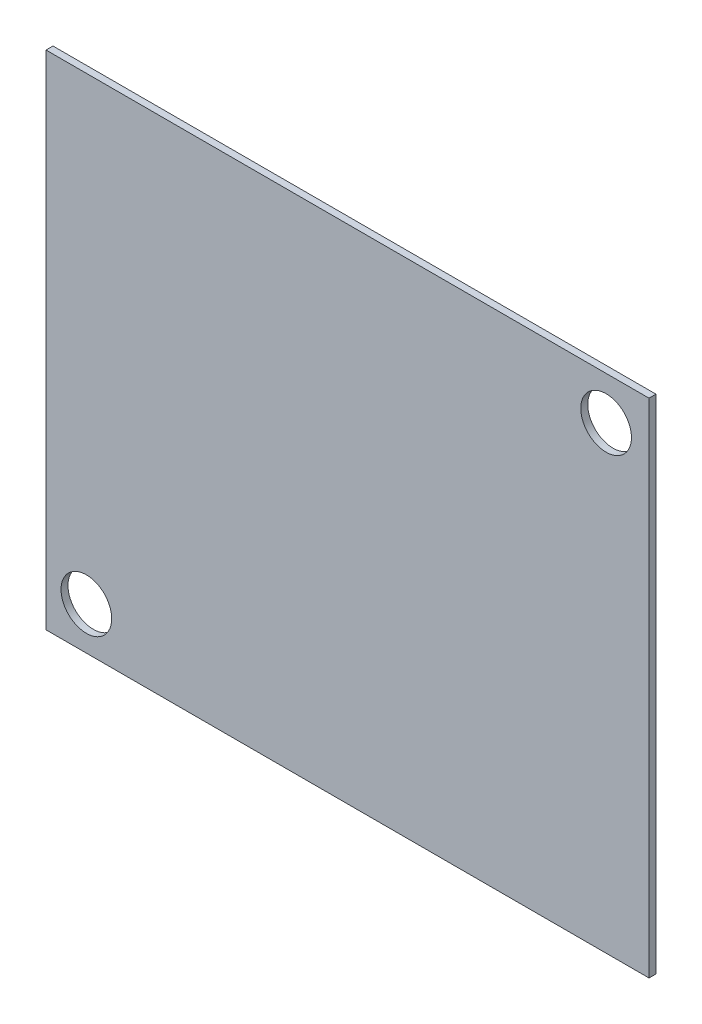
ISO-10303-21;
HEADER;
FILE_DESCRIPTION(('STEP AP214'),'2;1');
FILE_NAME('part.step','',(''),(''),'','','');
FILE_SCHEMA(('AUTOMOTIVE_DESIGN { 1 0 10303 214 1 1 1 1 }'));
ENDSEC;
DATA;
#1=APPLICATION_CONTEXT('core data for automotive mechanical design processes');
#2=APPLICATION_PROTOCOL_DEFINITION('international standard','automotive_design',2000,#1);
#3=PRODUCT_CONTEXT('',#1,'mechanical');
#4=PRODUCT('Part','Part','',(#3));
#5=PRODUCT_RELATED_PRODUCT_CATEGORY('part','',(#4));
#6=PRODUCT_DEFINITION_FORMATION('','',#4);
#7=PRODUCT_DEFINITION_CONTEXT('part definition',#1,'design');
#8=PRODUCT_DEFINITION('design','',#6,#7);
#9=PRODUCT_DEFINITION_SHAPE('','',#8);
#10=(LENGTH_UNIT() NAMED_UNIT(*) SI_UNIT(.MILLI.,.METRE.));
#11=(NAMED_UNIT(*) PLANE_ANGLE_UNIT() SI_UNIT($,.RADIAN.));
#12=(NAMED_UNIT(*) SI_UNIT($,.STERADIAN.) SOLID_ANGLE_UNIT());
#13=UNCERTAINTY_MEASURE_WITH_UNIT(LENGTH_MEASURE(1.E-05),#10,'distance_accuracy_value','');
#14=(GEOMETRIC_REPRESENTATION_CONTEXT(3) GLOBAL_UNCERTAINTY_ASSIGNED_CONTEXT((#13)) GLOBAL_UNIT_ASSIGNED_CONTEXT((#10,
#11,#12)) REPRESENTATION_CONTEXT('',''));
#15=CARTESIAN_POINT('',(0.,0.,0.));
#16=DIRECTION('',(0.,0.,1.));
#17=DIRECTION('',(1.,0.,0.));
#18=AXIS2_PLACEMENT_3D('',#15,#16,#17);
#19=CARTESIAN_POINT('',(67.564002990723,64.388999938965,0.));
#20=DIRECTION('',(0.,0.,-1.));
#21=DIRECTION('',(0.,-1.,0.));
#22=AXIS2_PLACEMENT_3D('',#19,#20,#21);
#23=PLANE('',#22);
#24=CARTESIAN_POINT('',(100.711,91.567,0.));
#25=DIRECTION('',(0.,0.,1.));
#26=DIRECTION('',(1.,0.,0.));
#27=AXIS2_PLACEMENT_3D('',#24,#25,#26);
#28=CIRCLE('',#27,1.5);
#29=CARTESIAN_POINT('',(102.211,91.567,0.));
#30=VERTEX_POINT('',#29);
#31=EDGE_CURVE('E28',#30,#30,#28,.T.);
#32=ORIENTED_EDGE('',*,*,#31,.F.);
#33=EDGE_LOOP('',(#32));
#34=FACE_BOUND('',#33,.T.);
#35=CARTESIAN_POINT('',(69.952,66.904,0.));
#36=DIRECTION('',(0.,0.,1.));
#37=DIRECTION('',(1.,0.,0.));
#38=AXIS2_PLACEMENT_3D('',#35,#36,#37);
#39=CIRCLE('',#38,1.5);
#40=CARTESIAN_POINT('',(71.452,66.904,0.));
#41=VERTEX_POINT('',#40);
#42=EDGE_CURVE('E136',#41,#41,#39,.T.);
#43=ORIENTED_EDGE('',*,*,#42,.F.);
#44=EDGE_LOOP('',(#43));
#45=FACE_BOUND('',#44,.T.);
#46=DIRECTION('',(1.,0.,0.));
#47=VECTOR('',#46,1.);
#48=CARTESIAN_POINT('',(67.564002990723,64.388999938965,0.));
#49=LINE('',#48,#47);
#50=CARTESIAN_POINT('',(67.564002990723,64.388999938965,0.));
#51=VERTEX_POINT('',#50);
#52=CARTESIAN_POINT('',(103.25099945068,64.388999938965,0.));
#53=VERTEX_POINT('',#52);
#54=EDGE_CURVE('E96',#51,#53,#49,.T.);
#55=ORIENTED_EDGE('',*,*,#54,.T.);
#56=DIRECTION('',(0.,1.,0.));
#57=VECTOR('',#56,1.);
#58=CARTESIAN_POINT('',(103.25099945068,64.388999938965,0.));
#59=LINE('',#58,#57);
#60=CARTESIAN_POINT('',(103.25099945068,94.107002258301,0.));
#61=VERTEX_POINT('',#60);
#62=EDGE_CURVE('E130',#53,#61,#59,.T.);
#63=ORIENTED_EDGE('',*,*,#62,.T.);
#64=DIRECTION('',(-1.,0.,0.));
#65=VECTOR('',#64,1.);
#66=CARTESIAN_POINT('',(103.25099945068,94.107002258301,0.));
#67=LINE('',#66,#65);
#68=CARTESIAN_POINT('',(67.564002990723,94.107002258301,0.));
#69=VERTEX_POINT('',#68);
#70=EDGE_CURVE('E98',#61,#69,#67,.T.);
#71=ORIENTED_EDGE('',*,*,#70,.T.);
#72=DIRECTION('',(0.,-1.,0.));
#73=VECTOR('',#72,1.);
#74=CARTESIAN_POINT('',(67.564002990723,94.107002258301,0.));
#75=LINE('',#74,#73);
#76=EDGE_CURVE('E64',#69,#51,#75,.T.);
#77=ORIENTED_EDGE('',*,*,#76,.T.);
#78=EDGE_LOOP('',(#55,#63,#71,#77));
#79=FACE_BOUND('',#78,.T.);
#80=ADVANCED_FACE('F17',(#34,#45,#79),#23,.F.);
#81=CARTESIAN_POINT('',(67.564002990723,64.388999938965,-0.41148));
#82=DIRECTION('',(0.,0.,-1.));
#83=DIRECTION('',(0.,-1.,0.));
#84=AXIS2_PLACEMENT_3D('',#81,#82,#83);
#85=PLANE('',#84);
#86=CARTESIAN_POINT('',(100.711,91.567,-0.41148));
#87=DIRECTION('',(0.,0.,1.));
#88=DIRECTION('',(1.,0.,0.));
#89=AXIS2_PLACEMENT_3D('',#86,#87,#88);
#90=CIRCLE('',#89,1.5);
#91=CARTESIAN_POINT('',(102.211,91.567,-0.41148));
#92=VERTEX_POINT('',#91);
#93=EDGE_CURVE('E11',#92,#92,#90,.T.);
#94=ORIENTED_EDGE('',*,*,#93,.T.);
#95=EDGE_LOOP('',(#94));
#96=FACE_BOUND('',#95,.T.);
#97=CARTESIAN_POINT('',(69.952,66.904,-0.41148));
#98=DIRECTION('',(0.,0.,1.));
#99=DIRECTION('',(1.,0.,0.));
#100=AXIS2_PLACEMENT_3D('',#97,#98,#99);
#101=CIRCLE('',#100,1.5);
#102=CARTESIAN_POINT('',(71.452,66.904,-0.41148));
#103=VERTEX_POINT('',#102);
#104=EDGE_CURVE('E74',#103,#103,#101,.T.);
#105=ORIENTED_EDGE('',*,*,#104,.T.);
#106=EDGE_LOOP('',(#105));
#107=FACE_BOUND('',#106,.T.);
#108=DIRECTION('',(0.,-1.,0.));
#109=VECTOR('',#108,1.);
#110=CARTESIAN_POINT('',(67.564002990723,94.107002258301,-0.41148));
#111=LINE('',#110,#109);
#112=CARTESIAN_POINT('',(67.564002990723,94.107002258301,-0.41148));
#113=VERTEX_POINT('',#112);
#114=CARTESIAN_POINT('',(67.564002990723,64.388999938965,-0.41148));
#115=VERTEX_POINT('',#114);
#116=EDGE_CURVE('E102',#113,#115,#111,.T.);
#117=ORIENTED_EDGE('',*,*,#116,.F.);
#118=DIRECTION('',(-1.,0.,0.));
#119=VECTOR('',#118,1.);
#120=CARTESIAN_POINT('',(103.25099945068,94.107002258301,-0.41148));
#121=LINE('',#120,#119);
#122=CARTESIAN_POINT('',(103.25099945068,94.107002258301,-0.41148));
#123=VERTEX_POINT('',#122);
#124=EDGE_CURVE('E88',#123,#113,#121,.T.);
#125=ORIENTED_EDGE('',*,*,#124,.F.);
#126=DIRECTION('',(0.,1.,0.));
#127=VECTOR('',#126,1.);
#128=CARTESIAN_POINT('',(103.25099945068,64.388999938965,-0.41148));
#129=LINE('',#128,#127);
#130=CARTESIAN_POINT('',(103.25099945068,64.388999938965,-0.41148));
#131=VERTEX_POINT('',#130);
#132=EDGE_CURVE('E112',#131,#123,#129,.T.);
#133=ORIENTED_EDGE('',*,*,#132,.F.);
#134=DIRECTION('',(1.,0.,0.));
#135=VECTOR('',#134,1.);
#136=CARTESIAN_POINT('',(67.564002990723,64.388999938965,-0.41148));
#137=LINE('',#136,#135);
#138=EDGE_CURVE('E123',#115,#131,#137,.T.);
#139=ORIENTED_EDGE('',*,*,#138,.F.);
#140=EDGE_LOOP('',(#117,#125,#133,#139));
#141=FACE_BOUND('',#140,.T.);
#142=ADVANCED_FACE('F220',(#96,#107,#141),#85,.T.);
#143=CARTESIAN_POINT('',(100.711,91.567,-0.41148));
#144=DIRECTION('',(0.,0.,-1.));
#145=DIRECTION('',(1.,0.,0.));
#146=AXIS2_PLACEMENT_3D('',#143,#144,#145);
#147=CYLINDRICAL_SURFACE('',#146,1.5);
#148=DIRECTION('',(0.,0.,1.));
#149=VECTOR('',#148,1.);
#150=CARTESIAN_POINT('',(102.211,91.567,-0.41148));
#151=LINE('',#150,#149);
#152=EDGE_CURVE('E141',#92,#30,#151,.T.);
#153=ORIENTED_EDGE('',*,*,#152,.T.);
#154=ORIENTED_EDGE('',*,*,#31,.T.);
#155=ORIENTED_EDGE('',*,*,#152,.F.);
#156=ORIENTED_EDGE('',*,*,#93,.F.);
#157=EDGE_LOOP('',(#153,#154,#155,#156));
#158=FACE_BOUND('',#157,.T.);
#159=ADVANCED_FACE('F214',(#158),#147,.F.);
#160=CARTESIAN_POINT('',(69.952,66.904,-0.41148));
#161=DIRECTION('',(0.,0.,-1.));
#162=DIRECTION('',(1.,0.,0.));
#163=AXIS2_PLACEMENT_3D('',#160,#161,#162);
#164=CYLINDRICAL_SURFACE('',#163,1.5);
#165=DIRECTION('',(0.,0.,1.));
#166=VECTOR('',#165,1.);
#167=CARTESIAN_POINT('',(71.452,66.904,-0.41148));
#168=LINE('',#167,#166);
#169=EDGE_CURVE('E101',#103,#41,#168,.T.);
#170=ORIENTED_EDGE('',*,*,#169,.T.);
#171=ORIENTED_EDGE('',*,*,#42,.T.);
#172=ORIENTED_EDGE('',*,*,#169,.F.);
#173=ORIENTED_EDGE('',*,*,#104,.F.);
#174=EDGE_LOOP('',(#170,#171,#172,#173));
#175=FACE_BOUND('',#174,.T.);
#176=ADVANCED_FACE('F19',(#175),#164,.F.);
#177=CARTESIAN_POINT('',(67.564002990723,94.107002258301,-0.41148));
#178=DIRECTION('',(1.,0.,0.));
#179=DIRECTION('',(0.,1.,0.));
#180=AXIS2_PLACEMENT_3D('',#177,#178,#179);
#181=PLANE('',#180);
#182=ORIENTED_EDGE('',*,*,#116,.T.);
#183=DIRECTION('',(0.,0.,1.));
#184=VECTOR('',#183,1.);
#185=CARTESIAN_POINT('',(67.564002990723,64.388999938965,-0.41148));
#186=LINE('',#185,#184);
#187=EDGE_CURVE('E106',#115,#51,#186,.T.);
#188=ORIENTED_EDGE('',*,*,#187,.T.);
#189=ORIENTED_EDGE('',*,*,#76,.F.);
#190=DIRECTION('',(0.,0.,1.));
#191=VECTOR('',#190,1.);
#192=CARTESIAN_POINT('',(67.564002990723,94.107002258301,-0.41148));
#193=LINE('',#192,#191);
#194=EDGE_CURVE('E21',#113,#69,#193,.T.);
#195=ORIENTED_EDGE('',*,*,#194,.F.);
#196=EDGE_LOOP('',(#182,#188,#189,#195));
#197=FACE_BOUND('',#196,.T.);
#198=ADVANCED_FACE('F107',(#197),#181,.F.);
#199=CARTESIAN_POINT('',(103.25099945068,94.107002258301,-0.41148));
#200=DIRECTION('',(0.,-1.,0.));
#201=DIRECTION('',(0.,0.,-1.));
#202=AXIS2_PLACEMENT_3D('',#199,#200,#201);
#203=PLANE('',#202);
#204=ORIENTED_EDGE('',*,*,#124,.T.);
#205=ORIENTED_EDGE('',*,*,#194,.T.);
#206=ORIENTED_EDGE('',*,*,#70,.F.);
#207=DIRECTION('',(0.,0.,1.));
#208=VECTOR('',#207,1.);
#209=CARTESIAN_POINT('',(103.25099945068,94.107002258301,-0.41148));
#210=LINE('',#209,#208);
#211=EDGE_CURVE('E127',#123,#61,#210,.T.);
#212=ORIENTED_EDGE('',*,*,#211,.F.);
#213=EDGE_LOOP('',(#204,#205,#206,#212));
#214=FACE_BOUND('',#213,.T.);
#215=ADVANCED_FACE('F158',(#214),#203,.F.);
#216=CARTESIAN_POINT('',(103.25099945068,64.388999938965,-0.41148));
#217=DIRECTION('',(-1.,0.,0.));
#218=DIRECTION('',(0.,0.,1.));
#219=AXIS2_PLACEMENT_3D('',#216,#217,#218);
#220=PLANE('',#219);
#221=ORIENTED_EDGE('',*,*,#132,.T.);
#222=ORIENTED_EDGE('',*,*,#211,.T.);
#223=ORIENTED_EDGE('',*,*,#62,.F.);
#224=DIRECTION('',(0.,0.,1.));
#225=VECTOR('',#224,1.);
#226=CARTESIAN_POINT('',(103.25099945068,64.388999938965,-0.41148));
#227=LINE('',#226,#225);
#228=EDGE_CURVE('E116',#131,#53,#227,.T.);
#229=ORIENTED_EDGE('',*,*,#228,.F.);
#230=EDGE_LOOP('',(#221,#222,#223,#229));
#231=FACE_BOUND('',#230,.T.);
#232=ADVANCED_FACE('F156',(#231),#220,.F.);
#233=CARTESIAN_POINT('',(67.564002990723,64.388999938965,-0.41148));
#234=DIRECTION('',(0.,1.,0.));
#235=DIRECTION('',(1.,0.,0.));
#236=AXIS2_PLACEMENT_3D('',#233,#234,#235);
#237=PLANE('',#236);
#238=ORIENTED_EDGE('',*,*,#138,.T.);
#239=ORIENTED_EDGE('',*,*,#228,.T.);
#240=ORIENTED_EDGE('',*,*,#54,.F.);
#241=ORIENTED_EDGE('',*,*,#187,.F.);
#242=EDGE_LOOP('',(#238,#239,#240,#241));
#243=FACE_BOUND('',#242,.T.);
#244=ADVANCED_FACE('F114',(#243),#237,.F.);
#245=CLOSED_SHELL('',(#80,#142,#159,#176,#198,#215,#232,#244));
#246=MANIFOLD_SOLID_BREP('B1',#245);
#247=ADVANCED_BREP_SHAPE_REPRESENTATION('',(#18,#246),#14);
#248=SHAPE_DEFINITION_REPRESENTATION(#9,#247);
ENDSEC;
END-ISO-10303-21;
